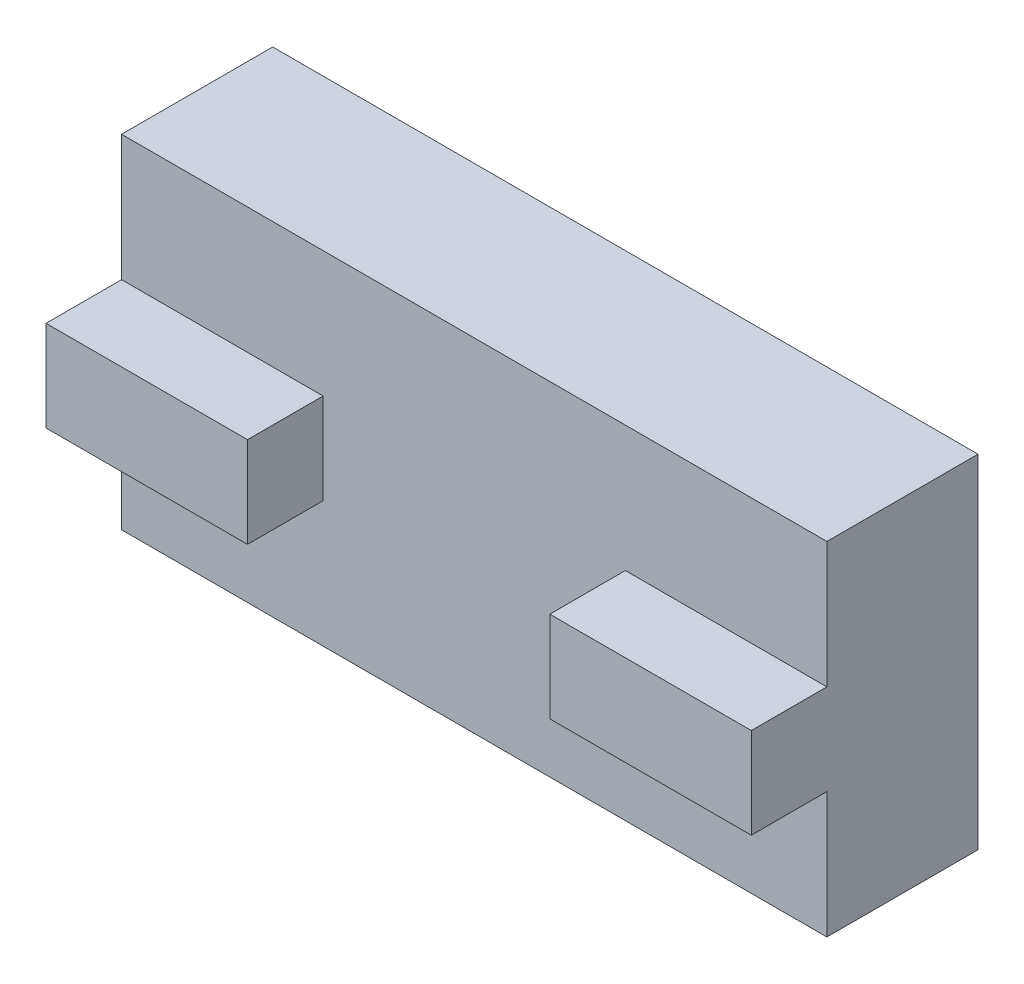
ISO-10303-21;
HEADER;
FILE_DESCRIPTION(('STEP AP214'),'2;1');
FILE_NAME('part.step','',(''),(''),'','','');
FILE_SCHEMA(('AUTOMOTIVE_DESIGN { 1 0 10303 214 1 1 1 1 }'));
ENDSEC;
DATA;
#1=APPLICATION_CONTEXT('core data for automotive mechanical design processes');
#2=APPLICATION_PROTOCOL_DEFINITION('international standard','automotive_design',2000,#1);
#3=PRODUCT_CONTEXT('',#1,'mechanical');
#4=PRODUCT('Part','Part','',(#3));
#5=PRODUCT_RELATED_PRODUCT_CATEGORY('part','',(#4));
#6=PRODUCT_DEFINITION_FORMATION('','',#4);
#7=PRODUCT_DEFINITION_CONTEXT('part definition',#1,'design');
#8=PRODUCT_DEFINITION('design','',#6,#7);
#9=PRODUCT_DEFINITION_SHAPE('','',#8);
#10=(LENGTH_UNIT() NAMED_UNIT(*) SI_UNIT(.MILLI.,.METRE.));
#11=(NAMED_UNIT(*) PLANE_ANGLE_UNIT() SI_UNIT($,.RADIAN.));
#12=(NAMED_UNIT(*) SI_UNIT($,.STERADIAN.) SOLID_ANGLE_UNIT());
#13=UNCERTAINTY_MEASURE_WITH_UNIT(LENGTH_MEASURE(1.E-05),#10,'distance_accuracy_value','');
#14=(GEOMETRIC_REPRESENTATION_CONTEXT(3) GLOBAL_UNCERTAINTY_ASSIGNED_CONTEXT((#13)) GLOBAL_UNIT_ASSIGNED_CONTEXT((#10,
#11,#12)) REPRESENTATION_CONTEXT('',''));
#15=CARTESIAN_POINT('',(0.,0.,0.));
#16=DIRECTION('',(0.,0.,1.));
#17=DIRECTION('',(1.,0.,0.));
#18=AXIS2_PLACEMENT_3D('',#15,#16,#17);
#19=CARTESIAN_POINT('',(200.,25.0000000000001,225.));
#20=DIRECTION('',(0.,-1.,0.));
#21=DIRECTION('',(1.,0.,0.));
#22=AXIS2_PLACEMENT_3D('',#19,#20,#21);
#23=PLANE('',#22);
#24=DIRECTION('',(0.,0.,1.));
#25=VECTOR('',#24,1.);
#26=CARTESIAN_POINT('',(0.,25.0000000000001,225.));
#27=LINE('',#26,#25);
#28=CARTESIAN_POINT('',(0.,25.0000000000002,150.));
#29=VERTEX_POINT('',#28);
#30=CARTESIAN_POINT('',(0.,25.0000000000001,225.));
#31=VERTEX_POINT('',#30);
#32=EDGE_CURVE('E157',#29,#31,#27,.T.);
#33=ORIENTED_EDGE('',*,*,#32,.F.);
#34=DIRECTION('',(-1.,0.,0.));
#35=VECTOR('',#34,1.);
#36=CARTESIAN_POINT('',(200.,25.0000000000001,150.));
#37=LINE('',#36,#35);
#38=CARTESIAN_POINT('',(200.,25.0000000000001,150.));
#39=VERTEX_POINT('',#38);
#40=EDGE_CURVE('E152',#39,#29,#37,.T.);
#41=ORIENTED_EDGE('',*,*,#40,.F.);
#42=DIRECTION('',(0.,0.,-1.));
#43=VECTOR('',#42,1.);
#44=CARTESIAN_POINT('',(200.,25.0000000000001,225.));
#45=LINE('',#44,#43);
#46=CARTESIAN_POINT('',(200.,25.0000000000001,225.));
#47=VERTEX_POINT('',#46);
#48=EDGE_CURVE('E175',#47,#39,#45,.T.);
#49=ORIENTED_EDGE('',*,*,#48,.F.);
#50=DIRECTION('',(-1.,0.,0.));
#51=VECTOR('',#50,1.);
#52=CARTESIAN_POINT('',(200.,25.0000000000001,225.));
#53=LINE('',#52,#51);
#54=EDGE_CURVE('E168',#47,#31,#53,.T.);
#55=ORIENTED_EDGE('',*,*,#54,.T.);
#56=EDGE_LOOP('',(#33,#41,#49,#55));
#57=FACE_BOUND('',#56,.T.);
#58=ADVANCED_FACE('F40',(#57),#23,.T.);
#59=CARTESIAN_POINT('',(-500.,115.,225.));
#60=DIRECTION('',(0.,1.,0.));
#61=DIRECTION('',(-1.,0.,0.));
#62=AXIS2_PLACEMENT_3D('',#59,#60,#61);
#63=PLANE('',#62);
#64=DIRECTION('',(0.,0.,-1.));
#65=VECTOR('',#64,1.);
#66=CARTESIAN_POINT('',(0.,115.,225.));
#67=LINE('',#66,#65);
#68=CARTESIAN_POINT('',(0.,115.,225.));
#69=VERTEX_POINT('',#68);
#70=CARTESIAN_POINT('',(0.,115.,150.));
#71=VERTEX_POINT('',#70);
#72=EDGE_CURVE('E242',#69,#71,#67,.T.);
#73=ORIENTED_EDGE('',*,*,#72,.F.);
#74=DIRECTION('',(1.,0.,0.));
#75=VECTOR('',#74,1.);
#76=CARTESIAN_POINT('',(-500.,115.,225.));
#77=LINE('',#76,#75);
#78=CARTESIAN_POINT('',(200.,115.,225.));
#79=VERTEX_POINT('',#78);
#80=EDGE_CURVE('E165',#69,#79,#77,.T.);
#81=ORIENTED_EDGE('',*,*,#80,.T.);
#82=DIRECTION('',(0.,0.,-1.));
#83=VECTOR('',#82,1.);
#84=CARTESIAN_POINT('',(200.,115.,225.));
#85=LINE('',#84,#83);
#86=CARTESIAN_POINT('',(200.,115.,150.));
#87=VERTEX_POINT('',#86);
#88=EDGE_CURVE('E169',#79,#87,#85,.T.);
#89=ORIENTED_EDGE('',*,*,#88,.T.);
#90=DIRECTION('',(1.,0.,0.));
#91=VECTOR('',#90,1.);
#92=CARTESIAN_POINT('',(-500.,115.,150.));
#93=LINE('',#92,#91);
#94=EDGE_CURVE('E58',#71,#87,#93,.T.);
#95=ORIENTED_EDGE('',*,*,#94,.F.);
#96=EDGE_LOOP('',(#73,#81,#89,#95));
#97=FACE_BOUND('',#96,.T.);
#98=ADVANCED_FACE('F250',(#97),#63,.T.);
#99=CARTESIAN_POINT('',(-500.,115.,225.));
#100=DIRECTION('',(0.,0.,1.));
#101=DIRECTION('',(1.,0.,0.));
#102=AXIS2_PLACEMENT_3D('',#99,#100,#101);
#103=PLANE('',#102);
#104=DIRECTION('',(0.,1.,0.));
#105=VECTOR('',#104,1.);
#106=CARTESIAN_POINT('',(0.,20.0000000000002,225.));
#107=LINE('',#106,#105);
#108=EDGE_CURVE('E127',#31,#69,#107,.T.);
#109=ORIENTED_EDGE('',*,*,#108,.F.);
#110=ORIENTED_EDGE('',*,*,#54,.F.);
#111=DIRECTION('',(0.,1.,0.));
#112=VECTOR('',#111,1.);
#113=CARTESIAN_POINT('',(200.,25.0000000000001,225.));
#114=LINE('',#113,#112);
#115=EDGE_CURVE('E162',#47,#79,#114,.T.);
#116=ORIENTED_EDGE('',*,*,#115,.T.);
#117=ORIENTED_EDGE('',*,*,#80,.F.);
#118=EDGE_LOOP('',(#109,#110,#116,#117));
#119=FACE_BOUND('',#118,.T.);
#120=ADVANCED_FACE('F230',(#119),#103,.T.);
#121=CARTESIAN_POINT('',(-500.,240.,150.));
#122=DIRECTION('',(1.,0.,0.));
#123=DIRECTION('',(0.,1.,0.));
#124=AXIS2_PLACEMENT_3D('',#121,#122,#123);
#125=PLANE('',#124);
#126=DIRECTION('',(0.,0.,-1.));
#127=VECTOR('',#126,1.);
#128=CARTESIAN_POINT('',(-500.,-99.9999999999999,150.));
#129=LINE('',#128,#127);
#130=CARTESIAN_POINT('',(-500.,-99.9999999999999,150.));
#131=VERTEX_POINT('',#130);
#132=CARTESIAN_POINT('',(-500.,-99.9999999999999,0.));
#133=VERTEX_POINT('',#132);
#134=EDGE_CURVE('E11',#131,#133,#129,.T.);
#135=ORIENTED_EDGE('',*,*,#134,.F.);
#136=DIRECTION('',(0.,-1.,0.));
#137=VECTOR('',#136,1.);
#138=CARTESIAN_POINT('',(-500.,240.,150.));
#139=LINE('',#138,#137);
#140=CARTESIAN_POINT('',(-500.,25.0000000000002,150.));
#141=VERTEX_POINT('',#140);
#142=EDGE_CURVE('E181',#141,#131,#139,.T.);
#143=ORIENTED_EDGE('',*,*,#142,.F.);
#144=DIRECTION('',(0.,0.,-1.));
#145=VECTOR('',#144,1.);
#146=CARTESIAN_POINT('',(-500.,25.0000000000002,225.));
#147=LINE('',#146,#145);
#148=CARTESIAN_POINT('',(-500.,25.0000000000002,225.));
#149=VERTEX_POINT('',#148);
#150=EDGE_CURVE('E174',#149,#141,#147,.T.);
#151=ORIENTED_EDGE('',*,*,#150,.F.);
#152=DIRECTION('',(0.,-1.,0.));
#153=VECTOR('',#152,1.);
#154=CARTESIAN_POINT('',(-500.,115.,225.));
#155=LINE('',#154,#153);
#156=CARTESIAN_POINT('',(-500.,115.,225.));
#157=VERTEX_POINT('',#156);
#158=EDGE_CURVE('E149',#157,#149,#155,.T.);
#159=ORIENTED_EDGE('',*,*,#158,.F.);
#160=DIRECTION('',(0.,0.,-1.));
#161=VECTOR('',#160,1.);
#162=CARTESIAN_POINT('',(-500.,115.,225.));
#163=LINE('',#162,#161);
#164=CARTESIAN_POINT('',(-500.,115.,150.));
#165=VERTEX_POINT('',#164);
#166=EDGE_CURVE('E161',#157,#165,#163,.T.);
#167=ORIENTED_EDGE('',*,*,#166,.T.);
#168=CARTESIAN_POINT('',(-500.,240.,150.));
#169=VERTEX_POINT('',#168);
#170=EDGE_CURVE('E150',#169,#165,#139,.T.);
#171=ORIENTED_EDGE('',*,*,#170,.F.);
#172=DIRECTION('',(0.,0.,-1.));
#173=VECTOR('',#172,1.);
#174=CARTESIAN_POINT('',(-500.,240.,150.));
#175=LINE('',#174,#173);
#176=CARTESIAN_POINT('',(-500.,240.,0.));
#177=VERTEX_POINT('',#176);
#178=EDGE_CURVE('E194',#169,#177,#175,.T.);
#179=ORIENTED_EDGE('',*,*,#178,.T.);
#180=DIRECTION('',(0.,-1.,0.));
#181=VECTOR('',#180,1.);
#182=CARTESIAN_POINT('',(-500.,240.,0.));
#183=LINE('',#182,#181);
#184=EDGE_CURVE('E180',#177,#133,#183,.T.);
#185=ORIENTED_EDGE('',*,*,#184,.T.);
#186=EDGE_LOOP('',(#135,#143,#151,#159,#167,#171,#179,#185));
#187=FACE_BOUND('',#186,.T.);
#188=ADVANCED_FACE('F233',(#187),#125,.F.);
#189=CARTESIAN_POINT('',(200.,-100.,150.));
#190=DIRECTION('',(0.,-1.,0.));
#191=DIRECTION('',(1.,0.,0.));
#192=AXIS2_PLACEMENT_3D('',#189,#190,#191);
#193=PLANE('',#192);
#194=DIRECTION('',(0.,0.,-1.));
#195=VECTOR('',#194,1.);
#196=CARTESIAN_POINT('',(200.,-100.,150.));
#197=LINE('',#196,#195);
#198=CARTESIAN_POINT('',(200.,-100.,150.));
#199=VERTEX_POINT('',#198);
#200=CARTESIAN_POINT('',(200.,-100.,0.));
#201=VERTEX_POINT('',#200);
#202=EDGE_CURVE('E44',#199,#201,#197,.T.);
#203=ORIENTED_EDGE('',*,*,#202,.F.);
#204=DIRECTION('',(-1.,0.,0.));
#205=VECTOR('',#204,1.);
#206=CARTESIAN_POINT('',(200.,-100.,150.));
#207=LINE('',#206,#205);
#208=EDGE_CURVE('E197',#199,#131,#207,.T.);
#209=ORIENTED_EDGE('',*,*,#208,.T.);
#210=ORIENTED_EDGE('',*,*,#134,.T.);
#211=DIRECTION('',(-1.,0.,0.));
#212=VECTOR('',#211,1.);
#213=CARTESIAN_POINT('',(200.,-100.,0.));
#214=LINE('',#213,#212);
#215=EDGE_CURVE('E184',#201,#133,#214,.T.);
#216=ORIENTED_EDGE('',*,*,#215,.F.);
#217=EDGE_LOOP('',(#203,#209,#210,#216));
#218=FACE_BOUND('',#217,.T.);
#219=ADVANCED_FACE('F39',(#218),#193,.T.);
#220=CARTESIAN_POINT('',(200.,-100.,150.));
#221=DIRECTION('',(-1.,0.,0.));
#222=DIRECTION('',(0.,0.,1.));
#223=AXIS2_PLACEMENT_3D('',#220,#221,#222);
#224=PLANE('',#223);
#225=DIRECTION('',(0.,0.,-1.));
#226=VECTOR('',#225,1.);
#227=CARTESIAN_POINT('',(200.,240.,150.));
#228=LINE('',#227,#226);
#229=CARTESIAN_POINT('',(200.,240.,150.));
#230=VERTEX_POINT('',#229);
#231=CARTESIAN_POINT('',(200.,240.,0.));
#232=VERTEX_POINT('',#231);
#233=EDGE_CURVE('E201',#230,#232,#228,.T.);
#234=ORIENTED_EDGE('',*,*,#233,.F.);
#235=DIRECTION('',(0.,1.,0.));
#236=VECTOR('',#235,1.);
#237=CARTESIAN_POINT('',(200.,-100.,150.));
#238=LINE('',#237,#236);
#239=EDGE_CURVE('E200',#87,#230,#238,.T.);
#240=ORIENTED_EDGE('',*,*,#239,.F.);
#241=ORIENTED_EDGE('',*,*,#88,.F.);
#242=ORIENTED_EDGE('',*,*,#115,.F.);
#243=ORIENTED_EDGE('',*,*,#48,.T.);
#244=EDGE_CURVE('E191',#199,#39,#238,.T.);
#245=ORIENTED_EDGE('',*,*,#244,.F.);
#246=ORIENTED_EDGE('',*,*,#202,.T.);
#247=DIRECTION('',(0.,1.,0.));
#248=VECTOR('',#247,1.);
#249=CARTESIAN_POINT('',(200.,-100.,0.));
#250=LINE('',#249,#248);
#251=EDGE_CURVE('E185',#201,#232,#250,.T.);
#252=ORIENTED_EDGE('',*,*,#251,.T.);
#253=EDGE_LOOP('',(#234,#240,#241,#242,#243,#245,#246,#252));
#254=FACE_BOUND('',#253,.T.);
#255=ADVANCED_FACE('F207',(#254),#224,.F.);
#256=CARTESIAN_POINT('',(-500.,240.,150.));
#257=DIRECTION('',(0.,1.,0.));
#258=DIRECTION('',(-1.,0.,0.));
#259=AXIS2_PLACEMENT_3D('',#256,#257,#258);
#260=PLANE('',#259);
#261=DIRECTION('',(1.,0.,0.));
#262=VECTOR('',#261,1.);
#263=CARTESIAN_POINT('',(-500.,240.,150.));
#264=LINE('',#263,#262);
#265=EDGE_CURVE('E189',#169,#230,#264,.T.);
#266=ORIENTED_EDGE('',*,*,#265,.T.);
#267=ORIENTED_EDGE('',*,*,#233,.T.);
#268=DIRECTION('',(1.,0.,0.));
#269=VECTOR('',#268,1.);
#270=CARTESIAN_POINT('',(-500.,240.,0.));
#271=LINE('',#270,#269);
#272=EDGE_CURVE('E178',#177,#232,#271,.T.);
#273=ORIENTED_EDGE('',*,*,#272,.F.);
#274=ORIENTED_EDGE('',*,*,#178,.F.);
#275=EDGE_LOOP('',(#266,#267,#273,#274));
#276=FACE_BOUND('',#275,.T.);
#277=ADVANCED_FACE('F216',(#276),#260,.T.);
#278=CARTESIAN_POINT('',(-500.,-99.9999999999999,150.));
#279=DIRECTION('',(0.,0.,-1.));
#280=DIRECTION('',(-1.,0.,0.));
#281=AXIS2_PLACEMENT_3D('',#278,#279,#280);
#282=PLANE('',#281);
#283=ORIENTED_EDGE('',*,*,#40,.T.);
#284=DIRECTION('',(0.,1.,0.));
#285=VECTOR('',#284,1.);
#286=CARTESIAN_POINT('',(0.,20.0000000000002,150.));
#287=LINE('',#286,#285);
#288=EDGE_CURVE('E131',#29,#71,#287,.T.);
#289=ORIENTED_EDGE('',*,*,#288,.T.);
#290=ORIENTED_EDGE('',*,*,#94,.T.);
#291=ORIENTED_EDGE('',*,*,#239,.T.);
#292=ORIENTED_EDGE('',*,*,#265,.F.);
#293=ORIENTED_EDGE('',*,*,#170,.T.);
#294=CARTESIAN_POINT('',(-300.,115.,150.));
#295=VERTEX_POINT('',#294);
#296=EDGE_CURVE('E140',#165,#295,#93,.T.);
#297=ORIENTED_EDGE('',*,*,#296,.T.);
#298=DIRECTION('',(0.,-1.,0.));
#299=VECTOR('',#298,1.);
#300=CARTESIAN_POINT('',(-300.,120.,150.));
#301=LINE('',#300,#299);
#302=CARTESIAN_POINT('',(-300.,25.0000000000002,150.));
#303=VERTEX_POINT('',#302);
#304=EDGE_CURVE('E125',#295,#303,#301,.T.);
#305=ORIENTED_EDGE('',*,*,#304,.T.);
#306=EDGE_CURVE('E159',#303,#141,#37,.T.);
#307=ORIENTED_EDGE('',*,*,#306,.T.);
#308=ORIENTED_EDGE('',*,*,#142,.T.);
#309=ORIENTED_EDGE('',*,*,#208,.F.);
#310=ORIENTED_EDGE('',*,*,#244,.T.);
#311=EDGE_LOOP('',(#283,#289,#290,#291,#292,#293,#297,#305,#307,#308,#309,#310));
#312=FACE_BOUND('',#311,.T.);
#313=ADVANCED_FACE('F143',(#312),#282,.F.);
#314=CARTESIAN_POINT('',(-500.,-99.9999999999999,0.));
#315=DIRECTION('',(0.,0.,-1.));
#316=DIRECTION('',(-1.,0.,0.));
#317=AXIS2_PLACEMENT_3D('',#314,#315,#316);
#318=PLANE('',#317);
#319=ORIENTED_EDGE('',*,*,#184,.F.);
#320=ORIENTED_EDGE('',*,*,#272,.T.);
#321=ORIENTED_EDGE('',*,*,#251,.F.);
#322=ORIENTED_EDGE('',*,*,#215,.T.);
#323=EDGE_LOOP('',(#319,#320,#321,#322));
#324=FACE_BOUND('',#323,.T.);
#325=ADVANCED_FACE('F214',(#324),#318,.T.);
#326=DIRECTION('',(0.,0.,-1.));
#327=VECTOR('',#326,1.);
#328=CARTESIAN_POINT('',(-300.,25.0000000000002,225.));
#329=LINE('',#328,#327);
#330=CARTESIAN_POINT('',(-300.,25.0000000000001,225.));
#331=VERTEX_POINT('',#330);
#332=EDGE_CURVE('E130',#331,#303,#329,.T.);
#333=ORIENTED_EDGE('',*,*,#332,.F.);
#334=EDGE_CURVE('E151',#331,#149,#53,.T.);
#335=ORIENTED_EDGE('',*,*,#334,.T.);
#336=ORIENTED_EDGE('',*,*,#150,.T.);
#337=ORIENTED_EDGE('',*,*,#306,.F.);
#338=EDGE_LOOP('',(#333,#335,#336,#337));
#339=FACE_BOUND('',#338,.T.);
#340=ADVANCED_FACE('F258',(#339),#23,.T.);
#341=DIRECTION('',(0.,0.,1.));
#342=VECTOR('',#341,1.);
#343=CARTESIAN_POINT('',(-300.,115.,225.));
#344=LINE('',#343,#342);
#345=CARTESIAN_POINT('',(-300.,115.,225.));
#346=VERTEX_POINT('',#345);
#347=EDGE_CURVE('E55',#295,#346,#344,.T.);
#348=ORIENTED_EDGE('',*,*,#347,.F.);
#349=ORIENTED_EDGE('',*,*,#296,.F.);
#350=ORIENTED_EDGE('',*,*,#166,.F.);
#351=EDGE_CURVE('E139',#157,#346,#77,.T.);
#352=ORIENTED_EDGE('',*,*,#351,.T.);
#353=EDGE_LOOP('',(#348,#349,#350,#352));
#354=FACE_BOUND('',#353,.T.);
#355=ADVANCED_FACE('F136',(#354),#63,.T.);
#356=DIRECTION('',(0.,-1.,0.));
#357=VECTOR('',#356,1.);
#358=CARTESIAN_POINT('',(-300.,120.,225.));
#359=LINE('',#358,#357);
#360=EDGE_CURVE('E141',#346,#331,#359,.T.);
#361=ORIENTED_EDGE('',*,*,#360,.F.);
#362=ORIENTED_EDGE('',*,*,#351,.F.);
#363=ORIENTED_EDGE('',*,*,#158,.T.);
#364=ORIENTED_EDGE('',*,*,#334,.F.);
#365=EDGE_LOOP('',(#361,#362,#363,#364));
#366=FACE_BOUND('',#365,.T.);
#367=ADVANCED_FACE('F239',(#366),#103,.T.);
#368=CARTESIAN_POINT('',(0.,20.0000000000002,-166.227766016838));
#369=DIRECTION('',(1.,0.,0.));
#370=DIRECTION('',(0.,0.,-1.));
#371=AXIS2_PLACEMENT_3D('',#368,#369,#370);
#372=PLANE('',#371);
#373=ORIENTED_EDGE('',*,*,#32,.T.);
#374=ORIENTED_EDGE('',*,*,#108,.T.);
#375=ORIENTED_EDGE('',*,*,#72,.T.);
#376=ORIENTED_EDGE('',*,*,#288,.F.);
#377=EDGE_LOOP('',(#373,#374,#375,#376));
#378=FACE_BOUND('',#377,.T.);
#379=ADVANCED_FACE('F247',(#378),#372,.F.);
#380=CARTESIAN_POINT('',(-300.,120.,-166.227766016838));
#381=DIRECTION('',(-1.,0.,0.));
#382=DIRECTION('',(0.,0.,1.));
#383=AXIS2_PLACEMENT_3D('',#380,#381,#382);
#384=PLANE('',#383);
#385=ORIENTED_EDGE('',*,*,#332,.T.);
#386=ORIENTED_EDGE('',*,*,#304,.F.);
#387=ORIENTED_EDGE('',*,*,#347,.T.);
#388=ORIENTED_EDGE('',*,*,#360,.T.);
#389=EDGE_LOOP('',(#385,#386,#387,#388));
#390=FACE_BOUND('',#389,.T.);
#391=ADVANCED_FACE('F124',(#390),#384,.F.);
#392=CLOSED_SHELL('',(#58,#98,#120,#188,#219,#255,#277,#313,#325,#340,#355,#367,#379,#391));
#393=MANIFOLD_SOLID_BREP('B2',#392);
#394=ADVANCED_BREP_SHAPE_REPRESENTATION('',(#18,#393),#14);
#395=SHAPE_DEFINITION_REPRESENTATION(#9,#394);
ENDSEC;
END-ISO-10303-21;
